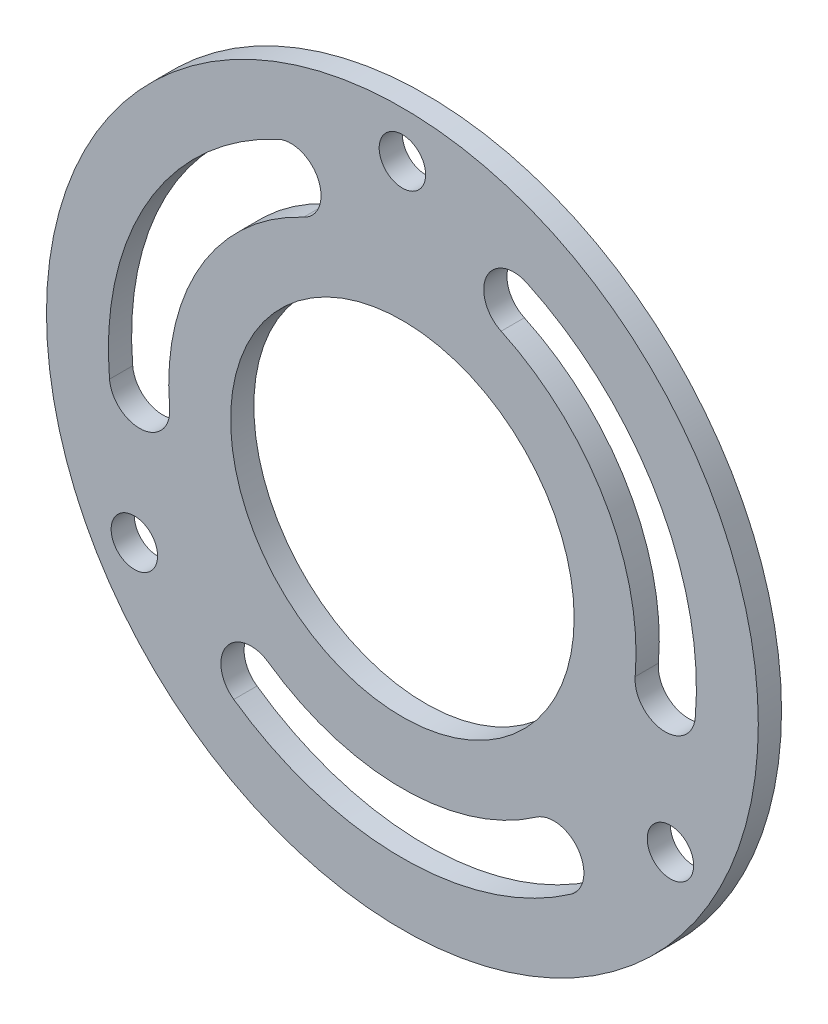
ISO-10303-21;
HEADER;
FILE_DESCRIPTION(('STEP AP214'),'2;1');
FILE_NAME('part.step','',(''),(''),'','','');
FILE_SCHEMA(('AUTOMOTIVE_DESIGN { 1 0 10303 214 1 1 1 1 }'));
ENDSEC;
DATA;
#1=APPLICATION_CONTEXT('core data for automotive mechanical design processes');
#2=APPLICATION_PROTOCOL_DEFINITION('international standard','automotive_design',2000,#1);
#3=PRODUCT_CONTEXT('',#1,'mechanical');
#4=PRODUCT('Part','Part','',(#3));
#5=PRODUCT_RELATED_PRODUCT_CATEGORY('part','',(#4));
#6=PRODUCT_DEFINITION_FORMATION('','',#4);
#7=PRODUCT_DEFINITION_CONTEXT('part definition',#1,'design');
#8=PRODUCT_DEFINITION('design','',#6,#7);
#9=PRODUCT_DEFINITION_SHAPE('','',#8);
#10=(LENGTH_UNIT() NAMED_UNIT(*) SI_UNIT(.MILLI.,.METRE.));
#11=(NAMED_UNIT(*) PLANE_ANGLE_UNIT() SI_UNIT($,.RADIAN.));
#12=(NAMED_UNIT(*) SI_UNIT($,.STERADIAN.) SOLID_ANGLE_UNIT());
#13=UNCERTAINTY_MEASURE_WITH_UNIT(LENGTH_MEASURE(1.E-05),#10,'distance_accuracy_value','');
#14=(GEOMETRIC_REPRESENTATION_CONTEXT(3) GLOBAL_UNCERTAINTY_ASSIGNED_CONTEXT((#13)) GLOBAL_UNIT_ASSIGNED_CONTEXT((#10,
#11,#12)) REPRESENTATION_CONTEXT('',''));
#15=CARTESIAN_POINT('',(0.,0.,0.));
#16=DIRECTION('',(0.,0.,1.));
#17=DIRECTION('',(1.,0.,0.));
#18=AXIS2_PLACEMENT_3D('',#15,#16,#17);
#19=CARTESIAN_POINT('',(0.,0.,1.5));
#20=DIRECTION('',(0.,0.,1.));
#21=DIRECTION('',(1.,0.,0.));
#22=AXIS2_PLACEMENT_3D('',#19,#20,#21);
#23=PLANE('',#22);
#24=CARTESIAN_POINT('',(-9.77947823978542,-13.9665423551273,1.5));
#25=DIRECTION('',(0.,0.,1.));
#26=DIRECTION('',(1.,0.,0.));
#27=AXIS2_PLACEMENT_3D('',#24,#25,#26);
#28=CIRCLE('',#27,1.95);
#29=CARTESIAN_POINT('',(-8.66100418890086,-12.3691958687637,1.5));
#30=VERTEX_POINT('',#29);
#31=CARTESIAN_POINT('',(-10.89795229067,-15.5638888414908,1.5));
#32=VERTEX_POINT('',#31);
#33=EDGE_CURVE('E50',#30,#32,#28,.T.);
#34=ORIENTED_EDGE('',*,*,#33,.F.);
#35=CARTESIAN_POINT('',(0.,0.,1.5));
#36=DIRECTION('',(0.,0.,-1.));
#37=DIRECTION('',(1.,0.,0.));
#38=AXIS2_PLACEMENT_3D('',#35,#36,#37);
#39=CIRCLE('',#38,15.1);
#40=CARTESIAN_POINT('',(8.66100418890087,-12.3691958687637,1.5));
#41=VERTEX_POINT('',#40);
#42=EDGE_CURVE('E169',#41,#30,#39,.T.);
#43=ORIENTED_EDGE('',*,*,#42,.F.);
#44=CARTESIAN_POINT('',(9.77947823978542,-13.9665423551272,1.5));
#45=DIRECTION('',(0.,0.,1.));
#46=DIRECTION('',(1.,0.,0.));
#47=AXIS2_PLACEMENT_3D('',#44,#45,#46);
#48=CIRCLE('',#47,1.95);
#49=CARTESIAN_POINT('',(10.89795229067,-15.5638888414908,1.5));
#50=VERTEX_POINT('',#49);
#51=EDGE_CURVE('E183',#50,#41,#48,.T.);
#52=ORIENTED_EDGE('',*,*,#51,.F.);
#53=CARTESIAN_POINT('',(0.,0.,1.5));
#54=DIRECTION('',(0.,0.,1.));
#55=DIRECTION('',(1.,0.,0.));
#56=AXIS2_PLACEMENT_3D('',#53,#54,#55);
#57=CIRCLE('',#56,19.);
#58=EDGE_CURVE('E180',#32,#50,#57,.T.);
#59=ORIENTED_EDGE('',*,*,#58,.F.);
#60=EDGE_LOOP('',(#34,#43,#52,#59));
#61=FACE_BOUND('',#60,.T.);
#62=CARTESIAN_POINT('',(16.9851196024642,-1.48600541384767,1.5));
#63=DIRECTION('',(0.,0.,1.));
#64=DIRECTION('',(1.,0.,0.));
#65=AXIS2_PLACEMENT_3D('',#62,#63,#64);
#66=CIRCLE('',#65,1.95);
#67=CARTESIAN_POINT('',(15.0425399411853,-1.31605171548972,1.5));
#68=VERTEX_POINT('',#67);
#69=CARTESIAN_POINT('',(18.9276992637432,-1.65595911220561,1.5));
#70=VERTEX_POINT('',#69);
#71=EDGE_CURVE('E58',#68,#70,#66,.T.);
#72=ORIENTED_EDGE('',*,*,#71,.F.);
#73=CARTESIAN_POINT('',(0.,0.,1.5));
#74=DIRECTION('',(0.,0.,-1.));
#75=DIRECTION('',(1.,0.,0.));
#76=AXIS2_PLACEMENT_3D('',#73,#74,#75);
#77=CIRCLE('',#76,15.1);
#78=CARTESIAN_POINT('',(6.38153575228447,13.6852475842535,1.5));
#79=VERTEX_POINT('',#78);
#80=EDGE_CURVE('E145',#79,#68,#77,.T.);
#81=ORIENTED_EDGE('',*,*,#80,.F.);
#82=CARTESIAN_POINT('',(7.20564136267882,15.4525477689749,1.5));
#83=DIRECTION('',(0.,0.,1.));
#84=DIRECTION('',(1.,0.,0.));
#85=AXIS2_PLACEMENT_3D('',#82,#83,#84);
#86=CIRCLE('',#85,1.95);
#87=CARTESIAN_POINT('',(8.02974697307318,17.2198479536964,1.5));
#88=VERTEX_POINT('',#87);
#89=EDGE_CURVE('E148',#88,#79,#86,.T.);
#90=ORIENTED_EDGE('',*,*,#89,.F.);
#91=CARTESIAN_POINT('',(0.,0.,1.5));
#92=DIRECTION('',(0.,0.,1.));
#93=DIRECTION('',(1.,0.,0.));
#94=AXIS2_PLACEMENT_3D('',#91,#92,#93);
#95=CIRCLE('',#94,19.);
#96=EDGE_CURVE('E154',#70,#88,#95,.T.);
#97=ORIENTED_EDGE('',*,*,#96,.F.);
#98=EDGE_LOOP('',(#72,#81,#90,#97));
#99=FACE_BOUND('',#98,.T.);
#100=CARTESIAN_POINT('',(-7.20564136267883,15.4525477689749,1.5));
#101=DIRECTION('',(0.,0.,1.));
#102=DIRECTION('',(1.,0.,0.));
#103=AXIS2_PLACEMENT_3D('',#100,#101,#102);
#104=CIRCLE('',#103,1.95);
#105=CARTESIAN_POINT('',(-6.38153575228448,13.6852475842535,1.5));
#106=VERTEX_POINT('',#105);
#107=CARTESIAN_POINT('',(-8.02974697307319,17.2198479536964,1.5));
#108=VERTEX_POINT('',#107);
#109=EDGE_CURVE('E161',#106,#108,#104,.T.);
#110=ORIENTED_EDGE('',*,*,#109,.F.);
#111=CARTESIAN_POINT('',(0.,0.,1.5));
#112=DIRECTION('',(0.,0.,-1.));
#113=DIRECTION('',(1.,0.,0.));
#114=AXIS2_PLACEMENT_3D('',#111,#112,#113);
#115=CIRCLE('',#114,15.1);
#116=CARTESIAN_POINT('',(-15.0425399411853,-1.31605171548974,1.5));
#117=VERTEX_POINT('',#116);
#118=EDGE_CURVE('E198',#117,#106,#115,.T.);
#119=ORIENTED_EDGE('',*,*,#118,.F.);
#120=CARTESIAN_POINT('',(-16.9851196024642,-1.48600541384768,1.5));
#121=DIRECTION('',(0.,0.,1.));
#122=DIRECTION('',(1.,0.,0.));
#123=AXIS2_PLACEMENT_3D('',#120,#121,#122);
#124=CIRCLE('',#123,1.95);
#125=CARTESIAN_POINT('',(-18.9276992637432,-1.65595911220563,1.5));
#126=VERTEX_POINT('',#125);
#127=EDGE_CURVE('E212',#126,#117,#124,.T.);
#128=ORIENTED_EDGE('',*,*,#127,.F.);
#129=CARTESIAN_POINT('',(0.,0.,1.5));
#130=DIRECTION('',(0.,0.,1.));
#131=DIRECTION('',(1.,0.,0.));
#132=AXIS2_PLACEMENT_3D('',#129,#130,#131);
#133=CIRCLE('',#132,19.);
#134=EDGE_CURVE('E209',#108,#126,#133,.T.);
#135=ORIENTED_EDGE('',*,*,#134,.F.);
#136=EDGE_LOOP('',(#110,#119,#128,#135));
#137=FACE_BOUND('',#136,.T.);
#138=CARTESIAN_POINT('',(-17.3205080756888,-10.,1.5));
#139=DIRECTION('',(0.,0.,1.));
#140=DIRECTION('',(1.,0.,0.));
#141=AXIS2_PLACEMENT_3D('',#138,#139,#140);
#142=CIRCLE('',#141,1.5);
#143=CARTESIAN_POINT('',(-15.8205080756888,-10.,1.5));
#144=VERTEX_POINT('',#143);
#145=EDGE_CURVE('E232',#144,#144,#142,.T.);
#146=ORIENTED_EDGE('',*,*,#145,.F.);
#147=EDGE_LOOP('',(#146));
#148=FACE_BOUND('',#147,.T.);
#149=CARTESIAN_POINT('',(0.,20.,1.5));
#150=DIRECTION('',(0.,0.,1.));
#151=DIRECTION('',(1.,0.,0.));
#152=AXIS2_PLACEMENT_3D('',#149,#150,#151);
#153=CIRCLE('',#152,1.5);
#154=CARTESIAN_POINT('',(1.5,20.,1.5));
#155=VERTEX_POINT('',#154);
#156=EDGE_CURVE('E244',#155,#155,#153,.T.);
#157=ORIENTED_EDGE('',*,*,#156,.F.);
#158=EDGE_LOOP('',(#157));
#159=FACE_BOUND('',#158,.T.);
#160=CARTESIAN_POINT('',(0.,0.,1.5));
#161=DIRECTION('',(0.,0.,1.));
#162=DIRECTION('',(1.,0.,0.));
#163=AXIS2_PLACEMENT_3D('',#160,#161,#162);
#164=CIRCLE('',#163,23.);
#165=CARTESIAN_POINT('',(23.,0.,1.5));
#166=VERTEX_POINT('',#165);
#167=EDGE_CURVE('E11',#166,#166,#164,.T.);
#168=ORIENTED_EDGE('',*,*,#167,.T.);
#169=EDGE_LOOP('',(#168));
#170=FACE_BOUND('',#169,.T.);
#171=CARTESIAN_POINT('',(17.3205080756888,-10.,1.5));
#172=DIRECTION('',(0.,0.,1.));
#173=DIRECTION('',(1.,0.,0.));
#174=AXIS2_PLACEMENT_3D('',#171,#172,#173);
#175=CIRCLE('',#174,1.5);
#176=CARTESIAN_POINT('',(18.8205080756888,-10.,1.5));
#177=VERTEX_POINT('',#176);
#178=EDGE_CURVE('E238',#177,#177,#175,.T.);
#179=ORIENTED_EDGE('',*,*,#178,.F.);
#180=EDGE_LOOP('',(#179));
#181=FACE_BOUND('',#180,.T.);
#182=CARTESIAN_POINT('',(0.,0.,1.5));
#183=DIRECTION('',(0.,0.,1.));
#184=DIRECTION('',(1.,0.,0.));
#185=AXIS2_PLACEMENT_3D('',#182,#183,#184);
#186=CIRCLE('',#185,11.1);
#187=CARTESIAN_POINT('',(11.1,0.,1.5));
#188=VERTEX_POINT('',#187);
#189=EDGE_CURVE('E226',#188,#188,#186,.T.);
#190=ORIENTED_EDGE('',*,*,#189,.F.);
#191=EDGE_LOOP('',(#190));
#192=FACE_BOUND('',#191,.T.);
#193=ADVANCED_FACE('F35',(#61,#99,#137,#148,#159,#170,#181,#192),#23,.T.);
#194=CARTESIAN_POINT('',(0.,0.,0.));
#195=DIRECTION('',(0.,0.,1.));
#196=DIRECTION('',(1.,0.,0.));
#197=AXIS2_PLACEMENT_3D('',#194,#195,#196);
#198=PLANE('',#197);
#199=CARTESIAN_POINT('',(0.,0.,0.));
#200=DIRECTION('',(0.,0.,-1.));
#201=DIRECTION('',(1.,0.,0.));
#202=AXIS2_PLACEMENT_3D('',#199,#200,#201);
#203=CIRCLE('',#202,15.1);
#204=CARTESIAN_POINT('',(8.66100418890087,-12.3691958687637,0.));
#205=VERTEX_POINT('',#204);
#206=CARTESIAN_POINT('',(-8.66100418890086,-12.3691958687637,0.));
#207=VERTEX_POINT('',#206);
#208=EDGE_CURVE('E175',#205,#207,#203,.T.);
#209=ORIENTED_EDGE('',*,*,#208,.T.);
#210=CARTESIAN_POINT('',(-9.77947823978542,-13.9665423551273,0.));
#211=DIRECTION('',(0.,0.,1.));
#212=DIRECTION('',(1.,0.,0.));
#213=AXIS2_PLACEMENT_3D('',#210,#211,#212);
#214=CIRCLE('',#213,1.95);
#215=CARTESIAN_POINT('',(-10.89795229067,-15.5638888414908,0.));
#216=VERTEX_POINT('',#215);
#217=EDGE_CURVE('E165',#207,#216,#214,.T.);
#218=ORIENTED_EDGE('',*,*,#217,.T.);
#219=CARTESIAN_POINT('',(0.,0.,0.));
#220=DIRECTION('',(0.,0.,1.));
#221=DIRECTION('',(1.,0.,0.));
#222=AXIS2_PLACEMENT_3D('',#219,#220,#221);
#223=CIRCLE('',#222,19.);
#224=CARTESIAN_POINT('',(10.89795229067,-15.5638888414908,0.));
#225=VERTEX_POINT('',#224);
#226=EDGE_CURVE('E168',#216,#225,#223,.T.);
#227=ORIENTED_EDGE('',*,*,#226,.T.);
#228=CARTESIAN_POINT('',(9.77947823978542,-13.9665423551272,0.));
#229=DIRECTION('',(0.,0.,1.));
#230=DIRECTION('',(1.,0.,0.));
#231=AXIS2_PLACEMENT_3D('',#228,#229,#230);
#232=CIRCLE('',#231,1.95);
#233=EDGE_CURVE('E172',#225,#205,#232,.T.);
#234=ORIENTED_EDGE('',*,*,#233,.T.);
#235=EDGE_LOOP('',(#209,#218,#227,#234));
#236=FACE_BOUND('',#235,.T.);
#237=CARTESIAN_POINT('',(0.,0.,0.));
#238=DIRECTION('',(0.,0.,-1.));
#239=DIRECTION('',(1.,0.,0.));
#240=AXIS2_PLACEMENT_3D('',#237,#238,#239);
#241=CIRCLE('',#240,15.1);
#242=CARTESIAN_POINT('',(6.38153575228447,13.6852475842535,0.));
#243=VERTEX_POINT('',#242);
#244=CARTESIAN_POINT('',(15.0425399411853,-1.31605171548972,0.));
#245=VERTEX_POINT('',#244);
#246=EDGE_CURVE('E132',#243,#245,#241,.T.);
#247=ORIENTED_EDGE('',*,*,#246,.T.);
#248=CARTESIAN_POINT('',(16.9851196024642,-1.48600541384767,0.));
#249=DIRECTION('',(0.,0.,1.));
#250=DIRECTION('',(1.,0.,0.));
#251=AXIS2_PLACEMENT_3D('',#248,#249,#250);
#252=CIRCLE('',#251,1.95);
#253=CARTESIAN_POINT('',(18.9276992637432,-1.65595911220561,0.));
#254=VERTEX_POINT('',#253);
#255=EDGE_CURVE('E126',#245,#254,#252,.T.);
#256=ORIENTED_EDGE('',*,*,#255,.T.);
#257=CARTESIAN_POINT('',(0.,0.,0.));
#258=DIRECTION('',(0.,0.,1.));
#259=DIRECTION('',(1.,0.,0.));
#260=AXIS2_PLACEMENT_3D('',#257,#258,#259);
#261=CIRCLE('',#260,19.);
#262=CARTESIAN_POINT('',(8.02974697307318,17.2198479536964,0.));
#263=VERTEX_POINT('',#262);
#264=EDGE_CURVE('E136',#254,#263,#261,.T.);
#265=ORIENTED_EDGE('',*,*,#264,.T.);
#266=CARTESIAN_POINT('',(7.20564136267882,15.4525477689749,0.));
#267=DIRECTION('',(0.,0.,1.));
#268=DIRECTION('',(1.,0.,0.));
#269=AXIS2_PLACEMENT_3D('',#266,#267,#268);
#270=CIRCLE('',#269,1.95);
#271=EDGE_CURVE('E140',#263,#243,#270,.T.);
#272=ORIENTED_EDGE('',*,*,#271,.T.);
#273=EDGE_LOOP('',(#247,#256,#265,#272));
#274=FACE_BOUND('',#273,.T.);
#275=CARTESIAN_POINT('',(0.,0.,0.));
#276=DIRECTION('',(0.,0.,-1.));
#277=DIRECTION('',(1.,0.,0.));
#278=AXIS2_PLACEMENT_3D('',#275,#276,#277);
#279=CIRCLE('',#278,15.1);
#280=CARTESIAN_POINT('',(-15.0425399411853,-1.31605171548974,0.));
#281=VERTEX_POINT('',#280);
#282=CARTESIAN_POINT('',(-6.38153575228448,13.6852475842535,0.));
#283=VERTEX_POINT('',#282);
#284=EDGE_CURVE('E204',#281,#283,#279,.T.);
#285=ORIENTED_EDGE('',*,*,#284,.T.);
#286=CARTESIAN_POINT('',(-7.20564136267883,15.4525477689749,0.));
#287=DIRECTION('',(0.,0.,1.));
#288=DIRECTION('',(1.,0.,0.));
#289=AXIS2_PLACEMENT_3D('',#286,#287,#288);
#290=CIRCLE('',#289,1.95);
#291=CARTESIAN_POINT('',(-8.02974697307319,17.2198479536964,0.));
#292=VERTEX_POINT('',#291);
#293=EDGE_CURVE('E194',#283,#292,#290,.T.);
#294=ORIENTED_EDGE('',*,*,#293,.T.);
#295=CARTESIAN_POINT('',(0.,0.,0.));
#296=DIRECTION('',(0.,0.,1.));
#297=DIRECTION('',(1.,0.,0.));
#298=AXIS2_PLACEMENT_3D('',#295,#296,#297);
#299=CIRCLE('',#298,19.);
#300=CARTESIAN_POINT('',(-18.9276992637432,-1.65595911220563,0.));
#301=VERTEX_POINT('',#300);
#302=EDGE_CURVE('E197',#292,#301,#299,.T.);
#303=ORIENTED_EDGE('',*,*,#302,.T.);
#304=CARTESIAN_POINT('',(-16.9851196024642,-1.48600541384768,0.));
#305=DIRECTION('',(0.,0.,1.));
#306=DIRECTION('',(1.,0.,0.));
#307=AXIS2_PLACEMENT_3D('',#304,#305,#306);
#308=CIRCLE('',#307,1.95);
#309=EDGE_CURVE('E201',#301,#281,#308,.T.);
#310=ORIENTED_EDGE('',*,*,#309,.T.);
#311=EDGE_LOOP('',(#285,#294,#303,#310));
#312=FACE_BOUND('',#311,.T.);
#313=CARTESIAN_POINT('',(0.,0.,0.));
#314=DIRECTION('',(0.,0.,1.));
#315=DIRECTION('',(1.,0.,0.));
#316=AXIS2_PLACEMENT_3D('',#313,#314,#315);
#317=CIRCLE('',#316,23.);
#318=CARTESIAN_POINT('',(23.,0.,0.));
#319=VERTEX_POINT('',#318);
#320=EDGE_CURVE('E39',#319,#319,#317,.T.);
#321=ORIENTED_EDGE('',*,*,#320,.F.);
#322=EDGE_LOOP('',(#321));
#323=FACE_BOUND('',#322,.T.);
#324=CARTESIAN_POINT('',(0.,20.,0.));
#325=DIRECTION('',(0.,0.,1.));
#326=DIRECTION('',(1.,0.,0.));
#327=AXIS2_PLACEMENT_3D('',#324,#325,#326);
#328=CIRCLE('',#327,1.5);
#329=CARTESIAN_POINT('',(1.5,20.,0.));
#330=VERTEX_POINT('',#329);
#331=EDGE_CURVE('E241',#330,#330,#328,.T.);
#332=ORIENTED_EDGE('',*,*,#331,.T.);
#333=EDGE_LOOP('',(#332));
#334=FACE_BOUND('',#333,.T.);
#335=CARTESIAN_POINT('',(17.3205080756888,-10.,0.));
#336=DIRECTION('',(0.,0.,1.));
#337=DIRECTION('',(1.,0.,0.));
#338=AXIS2_PLACEMENT_3D('',#335,#336,#337);
#339=CIRCLE('',#338,1.5);
#340=CARTESIAN_POINT('',(18.8205080756888,-10.,0.));
#341=VERTEX_POINT('',#340);
#342=EDGE_CURVE('E235',#341,#341,#339,.T.);
#343=ORIENTED_EDGE('',*,*,#342,.T.);
#344=EDGE_LOOP('',(#343));
#345=FACE_BOUND('',#344,.T.);
#346=CARTESIAN_POINT('',(-17.3205080756888,-10.,0.));
#347=DIRECTION('',(0.,0.,1.));
#348=DIRECTION('',(1.,0.,0.));
#349=AXIS2_PLACEMENT_3D('',#346,#347,#348);
#350=CIRCLE('',#349,1.5);
#351=CARTESIAN_POINT('',(-15.8205080756888,-10.,0.));
#352=VERTEX_POINT('',#351);
#353=EDGE_CURVE('E229',#352,#352,#350,.T.);
#354=ORIENTED_EDGE('',*,*,#353,.T.);
#355=EDGE_LOOP('',(#354));
#356=FACE_BOUND('',#355,.T.);
#357=CARTESIAN_POINT('',(0.,0.,0.));
#358=DIRECTION('',(0.,0.,1.));
#359=DIRECTION('',(1.,0.,0.));
#360=AXIS2_PLACEMENT_3D('',#357,#358,#359);
#361=CIRCLE('',#360,11.1);
#362=CARTESIAN_POINT('',(11.1,0.,0.));
#363=VERTEX_POINT('',#362);
#364=EDGE_CURVE('E219',#363,#363,#361,.T.);
#365=ORIENTED_EDGE('',*,*,#364,.T.);
#366=EDGE_LOOP('',(#365));
#367=FACE_BOUND('',#366,.T.);
#368=ADVANCED_FACE('F142',(#236,#274,#312,#323,#334,#345,#356,#367),#198,.F.);
#369=CARTESIAN_POINT('',(0.,0.,1.5));
#370=DIRECTION('',(0.,0.,-1.));
#371=DIRECTION('',(-1.,0.,0.));
#372=AXIS2_PLACEMENT_3D('',#369,#370,#371);
#373=CYLINDRICAL_SURFACE('',#372,23.);
#374=ORIENTED_EDGE('',*,*,#167,.F.);
#375=EDGE_LOOP('',(#374));
#376=FACE_BOUND('',#375,.T.);
#377=ORIENTED_EDGE('',*,*,#320,.T.);
#378=EDGE_LOOP('',(#377));
#379=FACE_BOUND('',#378,.T.);
#380=ADVANCED_FACE('F37',(#376,#379),#373,.T.);
#381=CARTESIAN_POINT('',(0.,20.,1.5));
#382=DIRECTION('',(0.,0.,-1.));
#383=DIRECTION('',(-1.,0.,0.));
#384=AXIS2_PLACEMENT_3D('',#381,#382,#383);
#385=CYLINDRICAL_SURFACE('',#384,1.5);
#386=ORIENTED_EDGE('',*,*,#156,.T.);
#387=EDGE_LOOP('',(#386));
#388=FACE_BOUND('',#387,.T.);
#389=ORIENTED_EDGE('',*,*,#331,.F.);
#390=EDGE_LOOP('',(#389));
#391=FACE_BOUND('',#390,.T.);
#392=ADVANCED_FACE('F252',(#388,#391),#385,.F.);
#393=CARTESIAN_POINT('',(17.3205080756888,-10.,1.5));
#394=DIRECTION('',(0.,0.,-1.));
#395=DIRECTION('',(-1.,0.,0.));
#396=AXIS2_PLACEMENT_3D('',#393,#394,#395);
#397=CYLINDRICAL_SURFACE('',#396,1.5);
#398=ORIENTED_EDGE('',*,*,#178,.T.);
#399=EDGE_LOOP('',(#398));
#400=FACE_BOUND('',#399,.T.);
#401=ORIENTED_EDGE('',*,*,#342,.F.);
#402=EDGE_LOOP('',(#401));
#403=FACE_BOUND('',#402,.T.);
#404=ADVANCED_FACE('F254',(#400,#403),#397,.F.);
#405=CARTESIAN_POINT('',(-17.3205080756888,-10.,1.5));
#406=DIRECTION('',(0.,0.,-1.));
#407=DIRECTION('',(-1.,0.,0.));
#408=AXIS2_PLACEMENT_3D('',#405,#406,#407);
#409=CYLINDRICAL_SURFACE('',#408,1.5);
#410=ORIENTED_EDGE('',*,*,#145,.T.);
#411=EDGE_LOOP('',(#410));
#412=FACE_BOUND('',#411,.T.);
#413=ORIENTED_EDGE('',*,*,#353,.F.);
#414=EDGE_LOOP('',(#413));
#415=FACE_BOUND('',#414,.T.);
#416=ADVANCED_FACE('F261',(#412,#415),#409,.F.);
#417=CARTESIAN_POINT('',(0.,0.,1.5));
#418=DIRECTION('',(0.,0.,-1.));
#419=DIRECTION('',(-1.,0.,0.));
#420=AXIS2_PLACEMENT_3D('',#417,#418,#419);
#421=CYLINDRICAL_SURFACE('',#420,11.1);
#422=ORIENTED_EDGE('',*,*,#189,.T.);
#423=EDGE_LOOP('',(#422));
#424=FACE_BOUND('',#423,.T.);
#425=ORIENTED_EDGE('',*,*,#364,.F.);
#426=EDGE_LOOP('',(#425));
#427=FACE_BOUND('',#426,.T.);
#428=ADVANCED_FACE('F291',(#424,#427),#421,.F.);
#429=CARTESIAN_POINT('',(-7.20564136267883,15.4525477689749,0.));
#430=DIRECTION('',(0.,0.,1.));
#431=DIRECTION('',(1.,0.,0.));
#432=AXIS2_PLACEMENT_3D('',#429,#430,#431);
#433=CYLINDRICAL_SURFACE('',#432,1.95);
#434=ORIENTED_EDGE('',*,*,#109,.T.);
#435=DIRECTION('',(0.,0.,1.));
#436=VECTOR('',#435,1.);
#437=CARTESIAN_POINT('',(-8.02974697307319,17.2198479536964,0.));
#438=LINE('',#437,#436);
#439=EDGE_CURVE('E207',#292,#108,#438,.T.);
#440=ORIENTED_EDGE('',*,*,#439,.F.);
#441=ORIENTED_EDGE('',*,*,#293,.F.);
#442=DIRECTION('',(0.,0.,1.));
#443=VECTOR('',#442,1.);
#444=CARTESIAN_POINT('',(-6.38153575228448,13.6852475842535,0.));
#445=LINE('',#444,#443);
#446=EDGE_CURVE('E217',#283,#106,#445,.T.);
#447=ORIENTED_EDGE('',*,*,#446,.T.);
#448=EDGE_LOOP('',(#434,#440,#441,#447));
#449=FACE_BOUND('',#448,.T.);
#450=ADVANCED_FACE('F294',(#449),#433,.F.);
#451=CARTESIAN_POINT('',(0.,0.,0.));
#452=DIRECTION('',(0.,0.,1.));
#453=DIRECTION('',(1.,0.,0.));
#454=AXIS2_PLACEMENT_3D('',#451,#452,#453);
#455=CYLINDRICAL_SURFACE('',#454,15.1);
#456=ORIENTED_EDGE('',*,*,#118,.T.);
#457=ORIENTED_EDGE('',*,*,#446,.F.);
#458=ORIENTED_EDGE('',*,*,#284,.F.);
#459=DIRECTION('',(0.,0.,1.));
#460=VECTOR('',#459,1.);
#461=CARTESIAN_POINT('',(-15.0425399411853,-1.31605171548974,0.));
#462=LINE('',#461,#460);
#463=EDGE_CURVE('E220',#281,#117,#462,.T.);
#464=ORIENTED_EDGE('',*,*,#463,.T.);
#465=EDGE_LOOP('',(#456,#457,#458,#464));
#466=FACE_BOUND('',#465,.T.);
#467=ADVANCED_FACE('F302',(#466),#455,.T.);
#468=CARTESIAN_POINT('',(-16.9851196024642,-1.48600541384768,0.));
#469=DIRECTION('',(0.,0.,1.));
#470=DIRECTION('',(1.,0.,0.));
#471=AXIS2_PLACEMENT_3D('',#468,#469,#470);
#472=CYLINDRICAL_SURFACE('',#471,1.95);
#473=ORIENTED_EDGE('',*,*,#127,.T.);
#474=ORIENTED_EDGE('',*,*,#463,.F.);
#475=ORIENTED_EDGE('',*,*,#309,.F.);
#476=DIRECTION('',(0.,0.,1.));
#477=VECTOR('',#476,1.);
#478=CARTESIAN_POINT('',(-18.9276992637432,-1.65595911220563,0.));
#479=LINE('',#478,#477);
#480=EDGE_CURVE('E222',#301,#126,#479,.T.);
#481=ORIENTED_EDGE('',*,*,#480,.T.);
#482=EDGE_LOOP('',(#473,#474,#475,#481));
#483=FACE_BOUND('',#482,.T.);
#484=ADVANCED_FACE('F311',(#483),#472,.F.);
#485=CARTESIAN_POINT('',(0.,0.,0.));
#486=DIRECTION('',(0.,0.,1.));
#487=DIRECTION('',(1.,0.,0.));
#488=AXIS2_PLACEMENT_3D('',#485,#486,#487);
#489=CYLINDRICAL_SURFACE('',#488,19.);
#490=ORIENTED_EDGE('',*,*,#134,.T.);
#491=ORIENTED_EDGE('',*,*,#480,.F.);
#492=ORIENTED_EDGE('',*,*,#302,.F.);
#493=ORIENTED_EDGE('',*,*,#439,.T.);
#494=EDGE_LOOP('',(#490,#491,#492,#493));
#495=FACE_BOUND('',#494,.T.);
#496=ADVANCED_FACE('F308',(#495),#489,.F.);
#497=CARTESIAN_POINT('',(16.9851196024642,-1.48600541384767,0.));
#498=DIRECTION('',(0.,0.,1.));
#499=DIRECTION('',(1.,0.,0.));
#500=AXIS2_PLACEMENT_3D('',#497,#498,#499);
#501=CYLINDRICAL_SURFACE('',#500,1.95);
#502=ORIENTED_EDGE('',*,*,#71,.T.);
#503=DIRECTION('',(0.,0.,1.));
#504=VECTOR('',#503,1.);
#505=CARTESIAN_POINT('',(18.9276992637432,-1.65595911220561,0.));
#506=LINE('',#505,#504);
#507=EDGE_CURVE('E122',#254,#70,#506,.T.);
#508=ORIENTED_EDGE('',*,*,#507,.F.);
#509=ORIENTED_EDGE('',*,*,#255,.F.);
#510=DIRECTION('',(0.,0.,1.));
#511=VECTOR('',#510,1.);
#512=CARTESIAN_POINT('',(15.0425399411853,-1.31605171548972,0.));
#513=LINE('',#512,#511);
#514=EDGE_CURVE('E159',#245,#68,#513,.T.);
#515=ORIENTED_EDGE('',*,*,#514,.T.);
#516=EDGE_LOOP('',(#502,#508,#509,#515));
#517=FACE_BOUND('',#516,.T.);
#518=ADVANCED_FACE('F124',(#517),#501,.F.);
#519=CARTESIAN_POINT('',(0.,0.,0.));
#520=DIRECTION('',(0.,0.,1.));
#521=DIRECTION('',(1.,0.,0.));
#522=AXIS2_PLACEMENT_3D('',#519,#520,#521);
#523=CYLINDRICAL_SURFACE('',#522,15.1);
#524=ORIENTED_EDGE('',*,*,#80,.T.);
#525=ORIENTED_EDGE('',*,*,#514,.F.);
#526=ORIENTED_EDGE('',*,*,#246,.F.);
#527=DIRECTION('',(0.,0.,1.));
#528=VECTOR('',#527,1.);
#529=CARTESIAN_POINT('',(6.38153575228447,13.6852475842535,0.));
#530=LINE('',#529,#528);
#531=EDGE_CURVE('E162',#243,#79,#530,.T.);
#532=ORIENTED_EDGE('',*,*,#531,.T.);
#533=EDGE_LOOP('',(#524,#525,#526,#532));
#534=FACE_BOUND('',#533,.T.);
#535=ADVANCED_FACE('F336',(#534),#523,.T.);
#536=CARTESIAN_POINT('',(7.20564136267882,15.4525477689749,0.));
#537=DIRECTION('',(0.,0.,1.));
#538=DIRECTION('',(1.,0.,0.));
#539=AXIS2_PLACEMENT_3D('',#536,#537,#538);
#540=CYLINDRICAL_SURFACE('',#539,1.95);
#541=ORIENTED_EDGE('',*,*,#89,.T.);
#542=ORIENTED_EDGE('',*,*,#531,.F.);
#543=ORIENTED_EDGE('',*,*,#271,.F.);
#544=DIRECTION('',(0.,0.,1.));
#545=VECTOR('',#544,1.);
#546=CARTESIAN_POINT('',(8.02974697307318,17.2198479536964,0.));
#547=LINE('',#546,#545);
#548=EDGE_CURVE('E131',#263,#88,#547,.T.);
#549=ORIENTED_EDGE('',*,*,#548,.T.);
#550=EDGE_LOOP('',(#541,#542,#543,#549));
#551=FACE_BOUND('',#550,.T.);
#552=ADVANCED_FACE('F339',(#551),#540,.F.);
#553=CARTESIAN_POINT('',(0.,0.,0.));
#554=DIRECTION('',(0.,0.,1.));
#555=DIRECTION('',(1.,0.,0.));
#556=AXIS2_PLACEMENT_3D('',#553,#554,#555);
#557=CYLINDRICAL_SURFACE('',#556,19.);
#558=ORIENTED_EDGE('',*,*,#96,.T.);
#559=ORIENTED_EDGE('',*,*,#548,.F.);
#560=ORIENTED_EDGE('',*,*,#264,.F.);
#561=ORIENTED_EDGE('',*,*,#507,.T.);
#562=EDGE_LOOP('',(#558,#559,#560,#561));
#563=FACE_BOUND('',#562,.T.);
#564=ADVANCED_FACE('F137',(#563),#557,.F.);
#565=CARTESIAN_POINT('',(-9.77947823978542,-13.9665423551273,0.));
#566=DIRECTION('',(0.,0.,1.));
#567=DIRECTION('',(1.,0.,0.));
#568=AXIS2_PLACEMENT_3D('',#565,#566,#567);
#569=CYLINDRICAL_SURFACE('',#568,1.95);
#570=ORIENTED_EDGE('',*,*,#33,.T.);
#571=DIRECTION('',(0.,0.,1.));
#572=VECTOR('',#571,1.);
#573=CARTESIAN_POINT('',(-10.89795229067,-15.5638888414908,0.));
#574=LINE('',#573,#572);
#575=EDGE_CURVE('E178',#216,#32,#574,.T.);
#576=ORIENTED_EDGE('',*,*,#575,.F.);
#577=ORIENTED_EDGE('',*,*,#217,.F.);
#578=DIRECTION('',(0.,0.,1.));
#579=VECTOR('',#578,1.);
#580=CARTESIAN_POINT('',(-8.66100418890086,-12.3691958687637,0.));
#581=LINE('',#580,#579);
#582=EDGE_CURVE('E155',#207,#30,#581,.T.);
#583=ORIENTED_EDGE('',*,*,#582,.T.);
#584=EDGE_LOOP('',(#570,#576,#577,#583));
#585=FACE_BOUND('',#584,.T.);
#586=ADVANCED_FACE('F319',(#585),#569,.F.);
#587=CARTESIAN_POINT('',(0.,0.,0.));
#588=DIRECTION('',(0.,0.,1.));
#589=DIRECTION('',(1.,0.,0.));
#590=AXIS2_PLACEMENT_3D('',#587,#588,#589);
#591=CYLINDRICAL_SURFACE('',#590,15.1);
#592=ORIENTED_EDGE('',*,*,#42,.T.);
#593=ORIENTED_EDGE('',*,*,#582,.F.);
#594=ORIENTED_EDGE('',*,*,#208,.F.);
#595=DIRECTION('',(0.,0.,1.));
#596=VECTOR('',#595,1.);
#597=CARTESIAN_POINT('',(8.66100418890087,-12.3691958687637,0.));
#598=LINE('',#597,#596);
#599=EDGE_CURVE('E189',#205,#41,#598,.T.);
#600=ORIENTED_EDGE('',*,*,#599,.T.);
#601=EDGE_LOOP('',(#592,#593,#594,#600));
#602=FACE_BOUND('',#601,.T.);
#603=ADVANCED_FACE('F322',(#602),#591,.T.);
#604=CARTESIAN_POINT('',(9.77947823978542,-13.9665423551272,0.));
#605=DIRECTION('',(0.,0.,1.));
#606=DIRECTION('',(1.,0.,0.));
#607=AXIS2_PLACEMENT_3D('',#604,#605,#606);
#608=CYLINDRICAL_SURFACE('',#607,1.95);
#609=ORIENTED_EDGE('',*,*,#51,.T.);
#610=ORIENTED_EDGE('',*,*,#599,.F.);
#611=ORIENTED_EDGE('',*,*,#233,.F.);
#612=DIRECTION('',(0.,0.,1.));
#613=VECTOR('',#612,1.);
#614=CARTESIAN_POINT('',(10.89795229067,-15.5638888414908,0.));
#615=LINE('',#614,#613);
#616=EDGE_CURVE('E191',#225,#50,#615,.T.);
#617=ORIENTED_EDGE('',*,*,#616,.T.);
#618=EDGE_LOOP('',(#609,#610,#611,#617));
#619=FACE_BOUND('',#618,.T.);
#620=ADVANCED_FACE('F326',(#619),#608,.F.);
#621=CARTESIAN_POINT('',(0.,0.,0.));
#622=DIRECTION('',(0.,0.,1.));
#623=DIRECTION('',(1.,0.,0.));
#624=AXIS2_PLACEMENT_3D('',#621,#622,#623);
#625=CYLINDRICAL_SURFACE('',#624,19.);
#626=ORIENTED_EDGE('',*,*,#58,.T.);
#627=ORIENTED_EDGE('',*,*,#616,.F.);
#628=ORIENTED_EDGE('',*,*,#226,.F.);
#629=ORIENTED_EDGE('',*,*,#575,.T.);
#630=EDGE_LOOP('',(#626,#627,#628,#629));
#631=FACE_BOUND('',#630,.T.);
#632=ADVANCED_FACE('F323',(#631),#625,.F.);
#633=CLOSED_SHELL('',(#193,#368,#380,#392,#404,#416,#428,#450,#467,#484,#496,#518,#535,#552,
#564,#586,#603,#620,#632));
#634=MANIFOLD_SOLID_BREP('B2',#633);
#635=ADVANCED_BREP_SHAPE_REPRESENTATION('',(#18,#634),#14);
#636=SHAPE_DEFINITION_REPRESENTATION(#9,#635);
ENDSEC;
END-ISO-10303-21;
